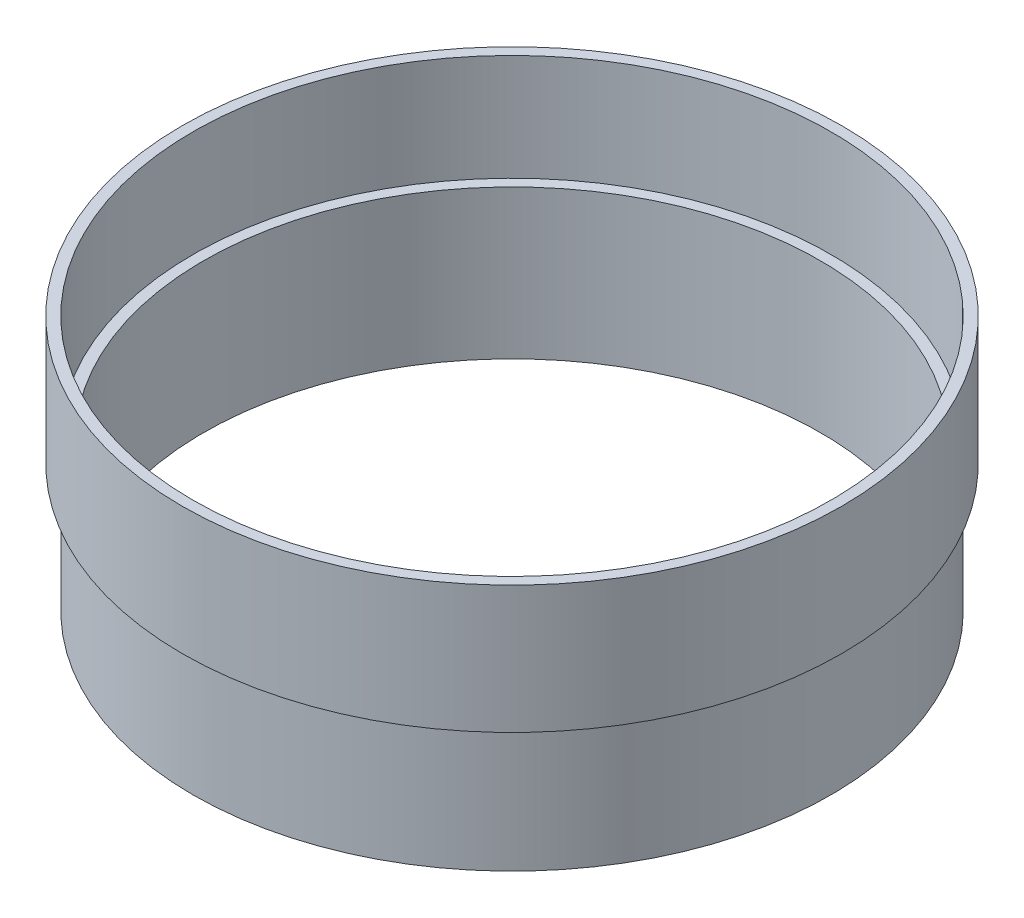
ISO-10303-21;
HEADER;
FILE_DESCRIPTION(('STEP AP214'),'2;1');
FILE_NAME('part.step','',(''),(''),'','','');
FILE_SCHEMA(('AUTOMOTIVE_DESIGN { 1 0 10303 214 1 1 1 1 }'));
ENDSEC;
DATA;
#1=APPLICATION_CONTEXT('core data for automotive mechanical design processes');
#2=APPLICATION_PROTOCOL_DEFINITION('international standard','automotive_design',2000,#1);
#3=PRODUCT_CONTEXT('',#1,'mechanical');
#4=PRODUCT('Part','Part','',(#3));
#5=PRODUCT_RELATED_PRODUCT_CATEGORY('part','',(#4));
#6=PRODUCT_DEFINITION_FORMATION('','',#4);
#7=PRODUCT_DEFINITION_CONTEXT('part definition',#1,'design');
#8=PRODUCT_DEFINITION('design','',#6,#7);
#9=PRODUCT_DEFINITION_SHAPE('','',#8);
#10=(LENGTH_UNIT() NAMED_UNIT(*) SI_UNIT(.MILLI.,.METRE.));
#11=(NAMED_UNIT(*) PLANE_ANGLE_UNIT() SI_UNIT($,.RADIAN.));
#12=(NAMED_UNIT(*) SI_UNIT($,.STERADIAN.) SOLID_ANGLE_UNIT());
#13=UNCERTAINTY_MEASURE_WITH_UNIT(LENGTH_MEASURE(1.E-05),#10,'distance_accuracy_value','');
#14=(GEOMETRIC_REPRESENTATION_CONTEXT(3) GLOBAL_UNCERTAINTY_ASSIGNED_CONTEXT((#13)) GLOBAL_UNIT_ASSIGNED_CONTEXT((#10,
#11,#12)) REPRESENTATION_CONTEXT('',''));
#15=CARTESIAN_POINT('',(0.,0.,0.));
#16=DIRECTION('',(0.,0.,1.));
#17=DIRECTION('',(1.,0.,0.));
#18=AXIS2_PLACEMENT_3D('',#15,#16,#17);
#19=CARTESIAN_POINT('',(0.,7.,0.));
#20=DIRECTION('',(0.,1.,0.));
#21=DIRECTION('',(0.,0.,1.));
#22=AXIS2_PLACEMENT_3D('',#19,#20,#21);
#23=PLANE('',#22);
#24=CARTESIAN_POINT('',(0.,7.,0.));
#25=DIRECTION('',(0.,1.,0.));
#26=DIRECTION('',(0.,0.,1.));
#27=AXIS2_PLACEMENT_3D('',#24,#25,#26);
#28=CIRCLE('',#27,14.5);
#29=CARTESIAN_POINT('',(0.,7.,14.5));
#30=VERTEX_POINT('',#29);
#31=EDGE_CURVE('E50',#30,#30,#28,.T.);
#32=ORIENTED_EDGE('',*,*,#31,.F.);
#33=EDGE_LOOP('',(#32));
#34=FACE_BOUND('',#33,.T.);
#35=CARTESIAN_POINT('',(0.,7.,0.));
#36=DIRECTION('',(0.,1.,0.));
#37=DIRECTION('',(0.,0.,1.));
#38=AXIS2_PLACEMENT_3D('',#35,#36,#37);
#39=CIRCLE('',#38,15.);
#40=CARTESIAN_POINT('',(0.,7.,15.));
#41=VERTEX_POINT('',#40);
#42=EDGE_CURVE('E57',#41,#41,#39,.T.);
#43=ORIENTED_EDGE('',*,*,#42,.T.);
#44=EDGE_LOOP('',(#43));
#45=FACE_BOUND('',#44,.T.);
#46=ADVANCED_FACE('F32',(#34,#45),#23,.T.);
#47=CARTESIAN_POINT('',(0.,0.,0.));
#48=DIRECTION('',(0.,1.,0.));
#49=DIRECTION('',(0.,0.,1.));
#50=AXIS2_PLACEMENT_3D('',#47,#48,#49);
#51=PLANE('',#50);
#52=CARTESIAN_POINT('',(0.,0.,0.));
#53=DIRECTION('',(0.,1.,0.));
#54=DIRECTION('',(0.,0.,1.));
#55=AXIS2_PLACEMENT_3D('',#52,#53,#54);
#56=CIRCLE('',#55,15.);
#57=CARTESIAN_POINT('',(0.,0.,15.));
#58=VERTEX_POINT('',#57);
#59=EDGE_CURVE('E36',#58,#58,#56,.T.);
#60=ORIENTED_EDGE('',*,*,#59,.F.);
#61=EDGE_LOOP('',(#60));
#62=FACE_BOUND('',#61,.T.);
#63=CARTESIAN_POINT('',(0.,0.,0.));
#64=DIRECTION('',(0.,1.,0.));
#65=DIRECTION('',(0.,0.,1.));
#66=AXIS2_PLACEMENT_3D('',#63,#64,#65);
#67=CIRCLE('',#66,14.5);
#68=CARTESIAN_POINT('',(0.,0.,14.5));
#69=VERTEX_POINT('',#68);
#70=EDGE_CURVE('E43',#69,#69,#67,.T.);
#71=ORIENTED_EDGE('',*,*,#70,.T.);
#72=EDGE_LOOP('',(#71));
#73=FACE_BOUND('',#72,.T.);
#74=ADVANCED_FACE('F81',(#62,#73),#51,.F.);
#75=CARTESIAN_POINT('',(0.,6.,0.));
#76=DIRECTION('',(0.,-1.,0.));
#77=DIRECTION('',(0.,0.,-1.));
#78=AXIS2_PLACEMENT_3D('',#75,#76,#77);
#79=CYLINDRICAL_SURFACE('',#78,15.);
#80=CARTESIAN_POINT('',(0.,6.,0.));
#81=DIRECTION('',(0.,1.,0.));
#82=DIRECTION('',(0.,0.,1.));
#83=AXIS2_PLACEMENT_3D('',#80,#81,#82);
#84=CIRCLE('',#83,15.);
#85=CARTESIAN_POINT('',(0.,6.,15.));
#86=VERTEX_POINT('',#85);
#87=EDGE_CURVE('E10',#86,#86,#84,.T.);
#88=ORIENTED_EDGE('',*,*,#87,.F.);
#89=EDGE_LOOP('',(#88));
#90=FACE_BOUND('',#89,.T.);
#91=ORIENTED_EDGE('',*,*,#59,.T.);
#92=EDGE_LOOP('',(#91));
#93=FACE_BOUND('',#92,.T.);
#94=ADVANCED_FACE('F34',(#90,#93),#79,.T.);
#95=CARTESIAN_POINT('',(0.,6.,0.));
#96=DIRECTION('',(0.,-1.,0.));
#97=DIRECTION('',(0.,0.,-1.));
#98=AXIS2_PLACEMENT_3D('',#95,#96,#97);
#99=CYLINDRICAL_SURFACE('',#98,14.5);
#100=ORIENTED_EDGE('',*,*,#70,.F.);
#101=EDGE_LOOP('',(#100));
#102=FACE_BOUND('',#101,.T.);
#103=ORIENTED_EDGE('',*,*,#31,.T.);
#104=EDGE_LOOP('',(#103));
#105=FACE_BOUND('',#104,.T.);
#106=ADVANCED_FACE('F91',(#102,#105),#99,.F.);
#107=CARTESIAN_POINT('',(0.,6.,0.));
#108=DIRECTION('',(0.,1.,0.));
#109=DIRECTION('',(0.,0.,1.));
#110=AXIS2_PLACEMENT_3D('',#107,#108,#109);
#111=PLANE('',#110);
#112=ORIENTED_EDGE('',*,*,#87,.T.);
#113=EDGE_LOOP('',(#112));
#114=FACE_BOUND('',#113,.T.);
#115=CARTESIAN_POINT('',(0.,6.,0.));
#116=DIRECTION('',(0.,1.,0.));
#117=DIRECTION('',(0.,0.,1.));
#118=AXIS2_PLACEMENT_3D('',#115,#116,#117);
#119=CIRCLE('',#118,15.5);
#120=CARTESIAN_POINT('',(0.,6.,15.5));
#121=VERTEX_POINT('',#120);
#122=EDGE_CURVE('E47',#121,#121,#119,.T.);
#123=ORIENTED_EDGE('',*,*,#122,.F.);
#124=EDGE_LOOP('',(#123));
#125=FACE_BOUND('',#124,.T.);
#126=ADVANCED_FACE('F76',(#114,#125),#111,.F.);
#127=CARTESIAN_POINT('',(0.,7.,0.));
#128=DIRECTION('',(0.,-1.,0.));
#129=DIRECTION('',(0.,0.,-1.));
#130=AXIS2_PLACEMENT_3D('',#127,#128,#129);
#131=CYLINDRICAL_SURFACE('',#130,15.5);
#132=ORIENTED_EDGE('',*,*,#122,.T.);
#133=EDGE_LOOP('',(#132));
#134=FACE_BOUND('',#133,.T.);
#135=CARTESIAN_POINT('',(0.,12.,0.));
#136=DIRECTION('',(0.,1.,0.));
#137=DIRECTION('',(0.,0.,1.));
#138=AXIS2_PLACEMENT_3D('',#135,#136,#137);
#139=CIRCLE('',#138,15.5);
#140=CARTESIAN_POINT('',(0.,12.,15.5));
#141=VERTEX_POINT('',#140);
#142=EDGE_CURVE('E53',#141,#141,#139,.T.);
#143=ORIENTED_EDGE('',*,*,#142,.F.);
#144=EDGE_LOOP('',(#143));
#145=FACE_BOUND('',#144,.T.);
#146=ADVANCED_FACE('F68',(#134,#145),#131,.T.);
#147=CARTESIAN_POINT('',(0.,12.,0.));
#148=DIRECTION('',(0.,1.,0.));
#149=DIRECTION('',(0.,0.,1.));
#150=AXIS2_PLACEMENT_3D('',#147,#148,#149);
#151=PLANE('',#150);
#152=ORIENTED_EDGE('',*,*,#142,.T.);
#153=EDGE_LOOP('',(#152));
#154=FACE_BOUND('',#153,.T.);
#155=CARTESIAN_POINT('',(0.,12.,0.));
#156=DIRECTION('',(0.,1.,0.));
#157=DIRECTION('',(0.,0.,1.));
#158=AXIS2_PLACEMENT_3D('',#155,#156,#157);
#159=CIRCLE('',#158,15.);
#160=CARTESIAN_POINT('',(0.,12.,15.));
#161=VERTEX_POINT('',#160);
#162=EDGE_CURVE('E56',#161,#161,#159,.T.);
#163=ORIENTED_EDGE('',*,*,#162,.F.);
#164=EDGE_LOOP('',(#163));
#165=FACE_BOUND('',#164,.T.);
#166=ADVANCED_FACE('F66',(#154,#165),#151,.T.);
#167=CARTESIAN_POINT('',(0.,12.,0.));
#168=DIRECTION('',(0.,-1.,0.));
#169=DIRECTION('',(0.,0.,-1.));
#170=AXIS2_PLACEMENT_3D('',#167,#168,#169);
#171=CYLINDRICAL_SURFACE('',#170,15.);
#172=ORIENTED_EDGE('',*,*,#162,.T.);
#173=EDGE_LOOP('',(#172));
#174=FACE_BOUND('',#173,.T.);
#175=ORIENTED_EDGE('',*,*,#42,.F.);
#176=EDGE_LOOP('',(#175));
#177=FACE_BOUND('',#176,.T.);
#178=ADVANCED_FACE('F63',(#174,#177),#171,.F.);
#179=CLOSED_SHELL('',(#46,#74,#94,#106,#126,#146,#166,#178));
#180=MANIFOLD_SOLID_BREP('B2',#179);
#181=ADVANCED_BREP_SHAPE_REPRESENTATION('',(#18,#180),#14);
#182=SHAPE_DEFINITION_REPRESENTATION(#9,#181);
ENDSEC;
END-ISO-10303-21;
